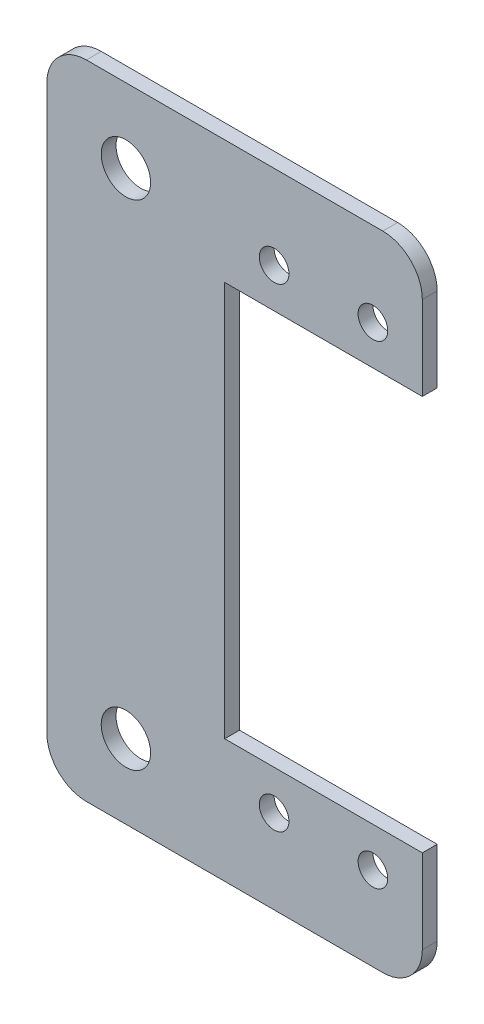
ISO-10303-21;
HEADER;
FILE_DESCRIPTION(('STEP AP214'),'2;1');
FILE_NAME('part.step','',(''),(''),'','','');
FILE_SCHEMA(('AUTOMOTIVE_DESIGN { 1 0 10303 214 1 1 1 1 }'));
ENDSEC;
DATA;
#1=APPLICATION_CONTEXT('core data for automotive mechanical design processes');
#2=APPLICATION_PROTOCOL_DEFINITION('international standard','automotive_design',2000,#1);
#3=PRODUCT_CONTEXT('',#1,'mechanical');
#4=PRODUCT('Part','Part','',(#3));
#5=PRODUCT_RELATED_PRODUCT_CATEGORY('part','',(#4));
#6=PRODUCT_DEFINITION_FORMATION('','',#4);
#7=PRODUCT_DEFINITION_CONTEXT('part definition',#1,'design');
#8=PRODUCT_DEFINITION('design','',#6,#7);
#9=PRODUCT_DEFINITION_SHAPE('','',#8);
#10=(LENGTH_UNIT() NAMED_UNIT(*) SI_UNIT(.MILLI.,.METRE.));
#11=(NAMED_UNIT(*) PLANE_ANGLE_UNIT() SI_UNIT($,.RADIAN.));
#12=(NAMED_UNIT(*) SI_UNIT($,.STERADIAN.) SOLID_ANGLE_UNIT());
#13=UNCERTAINTY_MEASURE_WITH_UNIT(LENGTH_MEASURE(1.E-05),#10,'distance_accuracy_value','');
#14=(GEOMETRIC_REPRESENTATION_CONTEXT(3) GLOBAL_UNCERTAINTY_ASSIGNED_CONTEXT((#13)) GLOBAL_UNIT_ASSIGNED_CONTEXT((#10,
#11,#12)) REPRESENTATION_CONTEXT('',''));
#15=CARTESIAN_POINT('',(0.,0.,0.));
#16=DIRECTION('',(0.,0.,1.));
#17=DIRECTION('',(1.,0.,0.));
#18=AXIS2_PLACEMENT_3D('',#15,#16,#17);
#19=CARTESIAN_POINT('',(0.,0.,1.5));
#20=DIRECTION('',(0.,0.,1.));
#21=DIRECTION('',(1.,0.,0.));
#22=AXIS2_PLACEMENT_3D('',#19,#20,#21);
#23=PLANE('',#22);
#24=CARTESIAN_POINT('',(23.,-24.,1.5));
#25=DIRECTION('',(0.,0.,1.));
#26=DIRECTION('',(-1.,0.,0.));
#27=AXIS2_PLACEMENT_3D('',#24,#25,#26);
#28=CIRCLE('',#27,1.5);
#29=CARTESIAN_POINT('',(21.5,-24.,1.5));
#30=VERTEX_POINT('',#29);
#31=EDGE_CURVE('E255',#30,#30,#28,.T.);
#32=ORIENTED_EDGE('',*,*,#31,.F.);
#33=EDGE_LOOP('',(#32));
#34=FACE_BOUND('',#33,.T.);
#35=CARTESIAN_POINT('',(33.,24.,1.5));
#36=DIRECTION('',(0.,0.,1.));
#37=DIRECTION('',(-1.,0.,0.));
#38=AXIS2_PLACEMENT_3D('',#35,#36,#37);
#39=CIRCLE('',#38,1.5);
#40=CARTESIAN_POINT('',(31.5,24.,1.5));
#41=VERTEX_POINT('',#40);
#42=EDGE_CURVE('E243',#41,#41,#39,.T.);
#43=ORIENTED_EDGE('',*,*,#42,.F.);
#44=EDGE_LOOP('',(#43));
#45=FACE_BOUND('',#44,.T.);
#46=CARTESIAN_POINT('',(8.,25.,1.5));
#47=DIRECTION('',(0.,0.,1.));
#48=DIRECTION('',(1.,0.,0.));
#49=AXIS2_PLACEMENT_3D('',#46,#47,#48);
#50=CIRCLE('',#49,2.5);
#51=CARTESIAN_POINT('',(10.5,25.,1.5));
#52=VERTEX_POINT('',#51);
#53=EDGE_CURVE('E225',#52,#52,#50,.T.);
#54=ORIENTED_EDGE('',*,*,#53,.F.);
#55=EDGE_LOOP('',(#54));
#56=FACE_BOUND('',#55,.T.);
#57=DIRECTION('',(0.,-1.,0.));
#58=VECTOR('',#57,1.);
#59=CARTESIAN_POINT('',(0.,32.5,1.5));
#60=LINE('',#59,#58);
#61=CARTESIAN_POINT('',(0.,28.5,1.5));
#62=VERTEX_POINT('',#61);
#63=CARTESIAN_POINT('',(0.,-28.5,1.5));
#64=VERTEX_POINT('',#63);
#65=EDGE_CURVE('E229',#62,#64,#60,.T.);
#66=ORIENTED_EDGE('',*,*,#65,.T.);
#67=CARTESIAN_POINT('',(4.,-28.5,1.5));
#68=DIRECTION('',(0.,0.,1.));
#69=DIRECTION('',(1.,0.,0.));
#70=AXIS2_PLACEMENT_3D('',#67,#68,#69);
#71=CIRCLE('',#70,4.);
#72=CARTESIAN_POINT('',(4.,-32.5,1.5));
#73=VERTEX_POINT('',#72);
#74=EDGE_CURVE('E176',#64,#73,#71,.T.);
#75=ORIENTED_EDGE('',*,*,#74,.T.);
#76=DIRECTION('',(1.,0.,0.));
#77=VECTOR('',#76,1.);
#78=CARTESIAN_POINT('',(38.,-32.5,1.5));
#79=LINE('',#78,#77);
#80=CARTESIAN_POINT('',(34.,-32.5,1.5));
#81=VERTEX_POINT('',#80);
#82=EDGE_CURVE('E227',#73,#81,#79,.T.);
#83=ORIENTED_EDGE('',*,*,#82,.T.);
#84=CARTESIAN_POINT('',(34.,-28.5,1.5));
#85=DIRECTION('',(0.,0.,1.));
#86=DIRECTION('',(1.,0.,0.));
#87=AXIS2_PLACEMENT_3D('',#84,#85,#86);
#88=CIRCLE('',#87,4.);
#89=CARTESIAN_POINT('',(38.,-28.5,1.5));
#90=VERTEX_POINT('',#89);
#91=EDGE_CURVE('E49',#81,#90,#88,.T.);
#92=ORIENTED_EDGE('',*,*,#91,.T.);
#93=DIRECTION('',(0.,1.,0.));
#94=VECTOR('',#93,1.);
#95=CARTESIAN_POINT('',(38.,-20.,1.5));
#96=LINE('',#95,#94);
#97=CARTESIAN_POINT('',(38.,-20.,1.5));
#98=VERTEX_POINT('',#97);
#99=EDGE_CURVE('E139',#90,#98,#96,.T.);
#100=ORIENTED_EDGE('',*,*,#99,.T.);
#101=DIRECTION('',(-1.,0.,0.));
#102=VECTOR('',#101,1.);
#103=CARTESIAN_POINT('',(38.,-20.,1.5));
#104=LINE('',#103,#102);
#105=CARTESIAN_POINT('',(18.,-20.,1.5));
#106=VERTEX_POINT('',#105);
#107=EDGE_CURVE('E134',#98,#106,#104,.T.);
#108=ORIENTED_EDGE('',*,*,#107,.T.);
#109=DIRECTION('',(0.,1.,0.));
#110=VECTOR('',#109,1.);
#111=CARTESIAN_POINT('',(18.,20.,1.5));
#112=LINE('',#111,#110);
#113=CARTESIAN_POINT('',(18.,20.,1.5));
#114=VERTEX_POINT('',#113);
#115=EDGE_CURVE('E124',#106,#114,#112,.T.);
#116=ORIENTED_EDGE('',*,*,#115,.T.);
#117=DIRECTION('',(1.,0.,0.));
#118=VECTOR('',#117,1.);
#119=CARTESIAN_POINT('',(38.,20.,1.5));
#120=LINE('',#119,#118);
#121=CARTESIAN_POINT('',(38.,20.,1.5));
#122=VERTEX_POINT('',#121);
#123=EDGE_CURVE('E133',#114,#122,#120,.T.);
#124=ORIENTED_EDGE('',*,*,#123,.T.);
#125=DIRECTION('',(0.,1.,0.));
#126=VECTOR('',#125,1.);
#127=CARTESIAN_POINT('',(38.,32.5,1.5));
#128=LINE('',#127,#126);
#129=CARTESIAN_POINT('',(38.,28.5,1.5));
#130=VERTEX_POINT('',#129);
#131=EDGE_CURVE('E218',#122,#130,#128,.T.);
#132=ORIENTED_EDGE('',*,*,#131,.T.);
#133=CARTESIAN_POINT('',(34.,28.5,1.5));
#134=DIRECTION('',(0.,0.,1.));
#135=DIRECTION('',(1.,0.,0.));
#136=AXIS2_PLACEMENT_3D('',#133,#134,#135);
#137=CIRCLE('',#136,4.);
#138=CARTESIAN_POINT('',(34.,32.5,1.5));
#139=VERTEX_POINT('',#138);
#140=EDGE_CURVE('E171',#130,#139,#137,.T.);
#141=ORIENTED_EDGE('',*,*,#140,.T.);
#142=DIRECTION('',(-1.,0.,0.));
#143=VECTOR('',#142,1.);
#144=CARTESIAN_POINT('',(38.,32.5,1.5));
#145=LINE('',#144,#143);
#146=CARTESIAN_POINT('',(4.,32.5,1.5));
#147=VERTEX_POINT('',#146);
#148=EDGE_CURVE('E187',#139,#147,#145,.T.);
#149=ORIENTED_EDGE('',*,*,#148,.T.);
#150=CARTESIAN_POINT('',(4.00000000000001,28.5,1.5));
#151=DIRECTION('',(0.,0.,1.));
#152=DIRECTION('',(1.,0.,0.));
#153=AXIS2_PLACEMENT_3D('',#150,#151,#152);
#154=CIRCLE('',#153,4.);
#155=EDGE_CURVE('E173',#147,#62,#154,.T.);
#156=ORIENTED_EDGE('',*,*,#155,.T.);
#157=EDGE_LOOP('',(#66,#75,#83,#92,#100,#108,#116,#124,#132,#141,#149,#156));
#158=FACE_BOUND('',#157,.T.);
#159=CARTESIAN_POINT('',(23.,24.,1.5));
#160=DIRECTION('',(0.,0.,1.));
#161=DIRECTION('',(1.,0.,0.));
#162=AXIS2_PLACEMENT_3D('',#159,#160,#161);
#163=CIRCLE('',#162,1.5);
#164=CARTESIAN_POINT('',(24.5,24.,1.5));
#165=VERTEX_POINT('',#164);
#166=EDGE_CURVE('E237',#165,#165,#163,.T.);
#167=ORIENTED_EDGE('',*,*,#166,.F.);
#168=EDGE_LOOP('',(#167));
#169=FACE_BOUND('',#168,.T.);
#170=CARTESIAN_POINT('',(33.,-24.,1.5));
#171=DIRECTION('',(0.,0.,1.));
#172=DIRECTION('',(1.,0.,0.));
#173=AXIS2_PLACEMENT_3D('',#170,#171,#172);
#174=CIRCLE('',#173,1.5);
#175=CARTESIAN_POINT('',(34.5,-24.,1.5));
#176=VERTEX_POINT('',#175);
#177=EDGE_CURVE('E249',#176,#176,#174,.T.);
#178=ORIENTED_EDGE('',*,*,#177,.F.);
#179=EDGE_LOOP('',(#178));
#180=FACE_BOUND('',#179,.T.);
#181=CARTESIAN_POINT('',(8.,-25.,1.5));
#182=DIRECTION('',(0.,0.,1.));
#183=DIRECTION('',(-1.,0.,0.));
#184=AXIS2_PLACEMENT_3D('',#181,#182,#183);
#185=CIRCLE('',#184,2.5);
#186=CARTESIAN_POINT('',(5.5,-25.,1.5));
#187=VERTEX_POINT('',#186);
#188=EDGE_CURVE('E261',#187,#187,#185,.T.);
#189=ORIENTED_EDGE('',*,*,#188,.F.);
#190=EDGE_LOOP('',(#189));
#191=FACE_BOUND('',#190,.T.);
#192=ADVANCED_FACE('F34',(#34,#45,#56,#158,#169,#180,#191),#23,.T.);
#193=CARTESIAN_POINT('',(0.,0.,0.));
#194=DIRECTION('',(0.,0.,1.));
#195=DIRECTION('',(1.,0.,0.));
#196=AXIS2_PLACEMENT_3D('',#193,#194,#195);
#197=PLANE('',#196);
#198=CARTESIAN_POINT('',(23.,-24.,0.));
#199=DIRECTION('',(0.,0.,1.));
#200=DIRECTION('',(-1.,0.,0.));
#201=AXIS2_PLACEMENT_3D('',#198,#199,#200);
#202=CIRCLE('',#201,1.5);
#203=CARTESIAN_POINT('',(21.5,-24.,0.));
#204=VERTEX_POINT('',#203);
#205=EDGE_CURVE('E258',#204,#204,#202,.T.);
#206=ORIENTED_EDGE('',*,*,#205,.T.);
#207=EDGE_LOOP('',(#206));
#208=FACE_BOUND('',#207,.T.);
#209=CARTESIAN_POINT('',(33.,24.,0.));
#210=DIRECTION('',(0.,0.,1.));
#211=DIRECTION('',(-1.,0.,0.));
#212=AXIS2_PLACEMENT_3D('',#209,#210,#211);
#213=CIRCLE('',#212,1.5);
#214=CARTESIAN_POINT('',(31.5,24.,0.));
#215=VERTEX_POINT('',#214);
#216=EDGE_CURVE('E246',#215,#215,#213,.T.);
#217=ORIENTED_EDGE('',*,*,#216,.T.);
#218=EDGE_LOOP('',(#217));
#219=FACE_BOUND('',#218,.T.);
#220=CARTESIAN_POINT('',(8.,25.,0.));
#221=DIRECTION('',(0.,0.,1.));
#222=DIRECTION('',(1.,0.,0.));
#223=AXIS2_PLACEMENT_3D('',#220,#221,#222);
#224=CIRCLE('',#223,2.5);
#225=CARTESIAN_POINT('',(10.5,25.,0.));
#226=VERTEX_POINT('',#225);
#227=EDGE_CURVE('E234',#226,#226,#224,.T.);
#228=ORIENTED_EDGE('',*,*,#227,.T.);
#229=EDGE_LOOP('',(#228));
#230=FACE_BOUND('',#229,.T.);
#231=DIRECTION('',(1.,0.,0.));
#232=VECTOR('',#231,1.);
#233=CARTESIAN_POINT('',(38.,-32.5,0.));
#234=LINE('',#233,#232);
#235=CARTESIAN_POINT('',(4.,-32.5,0.));
#236=VERTEX_POINT('',#235);
#237=CARTESIAN_POINT('',(34.,-32.5,0.));
#238=VERTEX_POINT('',#237);
#239=EDGE_CURVE('E201',#236,#238,#234,.T.);
#240=ORIENTED_EDGE('',*,*,#239,.F.);
#241=CARTESIAN_POINT('',(4.,-28.5,0.));
#242=DIRECTION('',(0.,0.,1.));
#243=DIRECTION('',(1.,0.,0.));
#244=AXIS2_PLACEMENT_3D('',#241,#242,#243);
#245=CIRCLE('',#244,4.);
#246=CARTESIAN_POINT('',(0.,-28.5,0.));
#247=VERTEX_POINT('',#246);
#248=EDGE_CURVE('E164',#236,#247,#245,.F.);
#249=ORIENTED_EDGE('',*,*,#248,.T.);
#250=DIRECTION('',(0.,-1.,0.));
#251=VECTOR('',#250,1.);
#252=CARTESIAN_POINT('',(0.,32.5,0.));
#253=LINE('',#252,#251);
#254=CARTESIAN_POINT('',(0.,28.5,0.));
#255=VERTEX_POINT('',#254);
#256=EDGE_CURVE('E197',#255,#247,#253,.T.);
#257=ORIENTED_EDGE('',*,*,#256,.F.);
#258=CARTESIAN_POINT('',(4.00000000000001,28.5,0.));
#259=DIRECTION('',(0.,0.,1.));
#260=DIRECTION('',(1.,0.,0.));
#261=AXIS2_PLACEMENT_3D('',#258,#259,#260);
#262=CIRCLE('',#261,4.);
#263=CARTESIAN_POINT('',(4.,32.5,0.));
#264=VERTEX_POINT('',#263);
#265=EDGE_CURVE('E160',#255,#264,#262,.F.);
#266=ORIENTED_EDGE('',*,*,#265,.T.);
#267=DIRECTION('',(-1.,0.,0.));
#268=VECTOR('',#267,1.);
#269=CARTESIAN_POINT('',(38.,32.5,0.));
#270=LINE('',#269,#268);
#271=CARTESIAN_POINT('',(34.,32.5,0.));
#272=VERTEX_POINT('',#271);
#273=EDGE_CURVE('E186',#272,#264,#270,.T.);
#274=ORIENTED_EDGE('',*,*,#273,.F.);
#275=CARTESIAN_POINT('',(34.,28.5,0.));
#276=DIRECTION('',(0.,0.,1.));
#277=DIRECTION('',(1.,0.,0.));
#278=AXIS2_PLACEMENT_3D('',#275,#276,#277);
#279=CIRCLE('',#278,4.);
#280=CARTESIAN_POINT('',(38.,28.5,0.));
#281=VERTEX_POINT('',#280);
#282=EDGE_CURVE('E158',#272,#281,#279,.F.);
#283=ORIENTED_EDGE('',*,*,#282,.T.);
#284=DIRECTION('',(0.,1.,0.));
#285=VECTOR('',#284,1.);
#286=CARTESIAN_POINT('',(38.,32.5,0.));
#287=LINE('',#286,#285);
#288=CARTESIAN_POINT('',(38.,20.,0.));
#289=VERTEX_POINT('',#288);
#290=EDGE_CURVE('E198',#289,#281,#287,.T.);
#291=ORIENTED_EDGE('',*,*,#290,.F.);
#292=DIRECTION('',(1.,0.,0.));
#293=VECTOR('',#292,1.);
#294=CARTESIAN_POINT('',(38.,20.,0.));
#295=LINE('',#294,#293);
#296=CARTESIAN_POINT('',(18.,20.,0.));
#297=VERTEX_POINT('',#296);
#298=EDGE_CURVE('E203',#297,#289,#295,.T.);
#299=ORIENTED_EDGE('',*,*,#298,.F.);
#300=DIRECTION('',(0.,1.,0.));
#301=VECTOR('',#300,1.);
#302=CARTESIAN_POINT('',(18.,20.,0.));
#303=LINE('',#302,#301);
#304=CARTESIAN_POINT('',(18.,-20.,0.));
#305=VERTEX_POINT('',#304);
#306=EDGE_CURVE('E221',#305,#297,#303,.T.);
#307=ORIENTED_EDGE('',*,*,#306,.F.);
#308=DIRECTION('',(-1.,0.,0.));
#309=VECTOR('',#308,1.);
#310=CARTESIAN_POINT('',(38.,-20.,0.));
#311=LINE('',#310,#309);
#312=CARTESIAN_POINT('',(38.,-20.,0.));
#313=VERTEX_POINT('',#312);
#314=EDGE_CURVE('E147',#313,#305,#311,.T.);
#315=ORIENTED_EDGE('',*,*,#314,.F.);
#316=DIRECTION('',(0.,1.,0.));
#317=VECTOR('',#316,1.);
#318=CARTESIAN_POINT('',(38.,-20.,0.));
#319=LINE('',#318,#317);
#320=CARTESIAN_POINT('',(38.,-28.5,0.));
#321=VERTEX_POINT('',#320);
#322=EDGE_CURVE('E143',#321,#313,#319,.T.);
#323=ORIENTED_EDGE('',*,*,#322,.F.);
#324=CARTESIAN_POINT('',(34.,-28.5,0.));
#325=DIRECTION('',(0.,0.,1.));
#326=DIRECTION('',(1.,0.,0.));
#327=AXIS2_PLACEMENT_3D('',#324,#325,#326);
#328=CIRCLE('',#327,4.);
#329=EDGE_CURVE('E162',#321,#238,#328,.F.);
#330=ORIENTED_EDGE('',*,*,#329,.T.);
#331=EDGE_LOOP('',(#240,#249,#257,#266,#274,#283,#291,#299,#307,#315,#323,#330));
#332=FACE_BOUND('',#331,.T.);
#333=CARTESIAN_POINT('',(23.,24.,0.));
#334=DIRECTION('',(0.,0.,1.));
#335=DIRECTION('',(1.,0.,0.));
#336=AXIS2_PLACEMENT_3D('',#333,#334,#335);
#337=CIRCLE('',#336,1.5);
#338=CARTESIAN_POINT('',(24.5,24.,0.));
#339=VERTEX_POINT('',#338);
#340=EDGE_CURVE('E240',#339,#339,#337,.T.);
#341=ORIENTED_EDGE('',*,*,#340,.T.);
#342=EDGE_LOOP('',(#341));
#343=FACE_BOUND('',#342,.T.);
#344=CARTESIAN_POINT('',(33.,-24.,0.));
#345=DIRECTION('',(0.,0.,1.));
#346=DIRECTION('',(1.,0.,0.));
#347=AXIS2_PLACEMENT_3D('',#344,#345,#346);
#348=CIRCLE('',#347,1.5);
#349=CARTESIAN_POINT('',(34.5,-24.,0.));
#350=VERTEX_POINT('',#349);
#351=EDGE_CURVE('E252',#350,#350,#348,.T.);
#352=ORIENTED_EDGE('',*,*,#351,.T.);
#353=EDGE_LOOP('',(#352));
#354=FACE_BOUND('',#353,.T.);
#355=CARTESIAN_POINT('',(8.,-25.,0.));
#356=DIRECTION('',(0.,0.,1.));
#357=DIRECTION('',(-1.,0.,0.));
#358=AXIS2_PLACEMENT_3D('',#355,#356,#357);
#359=CIRCLE('',#358,2.5);
#360=CARTESIAN_POINT('',(5.5,-25.,0.));
#361=VERTEX_POINT('',#360);
#362=EDGE_CURVE('E264',#361,#361,#359,.T.);
#363=ORIENTED_EDGE('',*,*,#362,.T.);
#364=EDGE_LOOP('',(#363));
#365=FACE_BOUND('',#364,.T.);
#366=ADVANCED_FACE('F192',(#208,#219,#230,#332,#343,#354,#365),#197,.F.);
#367=CARTESIAN_POINT('',(38.,-20.,1.5));
#368=DIRECTION('',(0.,-1.,0.));
#369=DIRECTION('',(0.,0.,-1.));
#370=AXIS2_PLACEMENT_3D('',#367,#368,#369);
#371=PLANE('',#370);
#372=ORIENTED_EDGE('',*,*,#314,.T.);
#373=DIRECTION('',(0.,0.,-1.));
#374=VECTOR('',#373,1.);
#375=CARTESIAN_POINT('',(18.,-20.,1.5));
#376=LINE('',#375,#374);
#377=EDGE_CURVE('E128',#106,#305,#376,.T.);
#378=ORIENTED_EDGE('',*,*,#377,.F.);
#379=ORIENTED_EDGE('',*,*,#107,.F.);
#380=DIRECTION('',(0.,0.,-1.));
#381=VECTOR('',#380,1.);
#382=CARTESIAN_POINT('',(38.,-20.,1.5));
#383=LINE('',#382,#381);
#384=EDGE_CURVE('E210',#98,#313,#383,.T.);
#385=ORIENTED_EDGE('',*,*,#384,.T.);
#386=EDGE_LOOP('',(#372,#378,#379,#385));
#387=FACE_BOUND('',#386,.T.);
#388=ADVANCED_FACE('F145',(#387),#371,.F.);
#389=CARTESIAN_POINT('',(18.,20.,1.5));
#390=DIRECTION('',(-1.,0.,0.));
#391=DIRECTION('',(0.,0.,1.));
#392=AXIS2_PLACEMENT_3D('',#389,#390,#391);
#393=PLANE('',#392);
#394=ORIENTED_EDGE('',*,*,#306,.T.);
#395=DIRECTION('',(0.,0.,-1.));
#396=VECTOR('',#395,1.);
#397=CARTESIAN_POINT('',(18.,20.,1.5));
#398=LINE('',#397,#396);
#399=EDGE_CURVE('E131',#114,#297,#398,.T.);
#400=ORIENTED_EDGE('',*,*,#399,.F.);
#401=ORIENTED_EDGE('',*,*,#115,.F.);
#402=ORIENTED_EDGE('',*,*,#377,.T.);
#403=EDGE_LOOP('',(#394,#400,#401,#402));
#404=FACE_BOUND('',#403,.T.);
#405=ADVANCED_FACE('F126',(#404),#393,.F.);
#406=CARTESIAN_POINT('',(38.,20.,1.5));
#407=DIRECTION('',(0.,1.,0.));
#408=DIRECTION('',(0.,0.,1.));
#409=AXIS2_PLACEMENT_3D('',#406,#407,#408);
#410=PLANE('',#409);
#411=ORIENTED_EDGE('',*,*,#298,.T.);
#412=DIRECTION('',(0.,0.,-1.));
#413=VECTOR('',#412,1.);
#414=CARTESIAN_POINT('',(38.,20.,1.5));
#415=LINE('',#414,#413);
#416=EDGE_CURVE('E152',#122,#289,#415,.T.);
#417=ORIENTED_EDGE('',*,*,#416,.F.);
#418=ORIENTED_EDGE('',*,*,#123,.F.);
#419=ORIENTED_EDGE('',*,*,#399,.T.);
#420=EDGE_LOOP('',(#411,#417,#418,#419));
#421=FACE_BOUND('',#420,.T.);
#422=ADVANCED_FACE('F303',(#421),#410,.F.);
#423=CARTESIAN_POINT('',(38.,32.5,1.5));
#424=DIRECTION('',(-1.,0.,0.));
#425=DIRECTION('',(0.,-1.,0.));
#426=AXIS2_PLACEMENT_3D('',#423,#424,#425);
#427=PLANE('',#426);
#428=ORIENTED_EDGE('',*,*,#290,.T.);
#429=DIRECTION('',(0.,0.,-1.));
#430=VECTOR('',#429,1.);
#431=CARTESIAN_POINT('',(38.,28.5,1.5));
#432=LINE('',#431,#430);
#433=EDGE_CURVE('E11',#281,#130,#432,.F.);
#434=ORIENTED_EDGE('',*,*,#433,.T.);
#435=ORIENTED_EDGE('',*,*,#131,.F.);
#436=ORIENTED_EDGE('',*,*,#416,.T.);
#437=EDGE_LOOP('',(#428,#434,#435,#436));
#438=FACE_BOUND('',#437,.T.);
#439=ADVANCED_FACE('F215',(#438),#427,.F.);
#440=CARTESIAN_POINT('',(38.,32.5,1.5));
#441=DIRECTION('',(0.,-1.,0.));
#442=DIRECTION('',(1.,0.,0.));
#443=AXIS2_PLACEMENT_3D('',#440,#441,#442);
#444=PLANE('',#443);
#445=ORIENTED_EDGE('',*,*,#273,.T.);
#446=DIRECTION('',(0.,0.,-1.));
#447=VECTOR('',#446,1.);
#448=CARTESIAN_POINT('',(4.,32.5,1.5));
#449=LINE('',#448,#447);
#450=EDGE_CURVE('E42',#264,#147,#449,.F.);
#451=ORIENTED_EDGE('',*,*,#450,.T.);
#452=ORIENTED_EDGE('',*,*,#148,.F.);
#453=DIRECTION('',(0.,0.,-1.));
#454=VECTOR('',#453,1.);
#455=CARTESIAN_POINT('',(34.,32.5,1.5));
#456=LINE('',#455,#454);
#457=EDGE_CURVE('E181',#139,#272,#456,.T.);
#458=ORIENTED_EDGE('',*,*,#457,.T.);
#459=EDGE_LOOP('',(#445,#451,#452,#458));
#460=FACE_BOUND('',#459,.T.);
#461=ADVANCED_FACE('F185',(#460),#444,.F.);
#462=CARTESIAN_POINT('',(0.,32.5,1.5));
#463=DIRECTION('',(1.,0.,0.));
#464=DIRECTION('',(0.,0.,-1.));
#465=AXIS2_PLACEMENT_3D('',#462,#463,#464);
#466=PLANE('',#465);
#467=ORIENTED_EDGE('',*,*,#256,.T.);
#468=DIRECTION('',(0.,0.,-1.));
#469=VECTOR('',#468,1.);
#470=CARTESIAN_POINT('',(0.,-28.5,1.5));
#471=LINE('',#470,#469);
#472=EDGE_CURVE('E169',#247,#64,#471,.F.);
#473=ORIENTED_EDGE('',*,*,#472,.T.);
#474=ORIENTED_EDGE('',*,*,#65,.F.);
#475=DIRECTION('',(0.,0.,-1.));
#476=VECTOR('',#475,1.);
#477=CARTESIAN_POINT('',(0.,28.5,1.5));
#478=LINE('',#477,#476);
#479=EDGE_CURVE('E166',#62,#255,#478,.T.);
#480=ORIENTED_EDGE('',*,*,#479,.T.);
#481=EDGE_LOOP('',(#467,#473,#474,#480));
#482=FACE_BOUND('',#481,.T.);
#483=ADVANCED_FACE('F294',(#482),#466,.F.);
#484=CARTESIAN_POINT('',(38.,-32.5,1.5));
#485=DIRECTION('',(0.,1.,0.));
#486=DIRECTION('',(-1.,0.,0.));
#487=AXIS2_PLACEMENT_3D('',#484,#485,#486);
#488=PLANE('',#487);
#489=ORIENTED_EDGE('',*,*,#82,.F.);
#490=DIRECTION('',(0.,0.,-1.));
#491=VECTOR('',#490,1.);
#492=CARTESIAN_POINT('',(4.,-32.5,1.5));
#493=LINE('',#492,#491);
#494=EDGE_CURVE('E150',#73,#236,#493,.T.);
#495=ORIENTED_EDGE('',*,*,#494,.T.);
#496=ORIENTED_EDGE('',*,*,#239,.T.);
#497=DIRECTION('',(0.,0.,-1.));
#498=VECTOR('',#497,1.);
#499=CARTESIAN_POINT('',(34.,-32.5,1.5));
#500=LINE('',#499,#498);
#501=EDGE_CURVE('E148',#238,#81,#500,.F.);
#502=ORIENTED_EDGE('',*,*,#501,.T.);
#503=EDGE_LOOP('',(#489,#495,#496,#502));
#504=FACE_BOUND('',#503,.T.);
#505=ADVANCED_FACE('F290',(#504),#488,.F.);
#506=CARTESIAN_POINT('',(38.,-20.,1.5));
#507=DIRECTION('',(-1.,0.,0.));
#508=DIRECTION('',(0.,-1.,0.));
#509=AXIS2_PLACEMENT_3D('',#506,#507,#508);
#510=PLANE('',#509);
#511=ORIENTED_EDGE('',*,*,#99,.F.);
#512=DIRECTION('',(0.,0.,-1.));
#513=VECTOR('',#512,1.);
#514=CARTESIAN_POINT('',(38.,-28.5,1.5));
#515=LINE('',#514,#513);
#516=EDGE_CURVE('E178',#90,#321,#515,.T.);
#517=ORIENTED_EDGE('',*,*,#516,.T.);
#518=ORIENTED_EDGE('',*,*,#322,.T.);
#519=ORIENTED_EDGE('',*,*,#384,.F.);
#520=EDGE_LOOP('',(#511,#517,#518,#519));
#521=FACE_BOUND('',#520,.T.);
#522=ADVANCED_FACE('F287',(#521),#510,.F.);
#523=CARTESIAN_POINT('',(8.,25.,1.5));
#524=DIRECTION('',(0.,0.,-1.));
#525=DIRECTION('',(-1.,0.,0.));
#526=AXIS2_PLACEMENT_3D('',#523,#524,#525);
#527=CYLINDRICAL_SURFACE('',#526,2.5);
#528=ORIENTED_EDGE('',*,*,#53,.T.);
#529=EDGE_LOOP('',(#528));
#530=FACE_BOUND('',#529,.T.);
#531=ORIENTED_EDGE('',*,*,#227,.F.);
#532=EDGE_LOOP('',(#531));
#533=FACE_BOUND('',#532,.T.);
#534=ADVANCED_FACE('F284',(#530,#533),#527,.F.);
#535=CARTESIAN_POINT('',(23.,24.,1.5));
#536=DIRECTION('',(0.,0.,-1.));
#537=DIRECTION('',(-1.,0.,0.));
#538=AXIS2_PLACEMENT_3D('',#535,#536,#537);
#539=CYLINDRICAL_SURFACE('',#538,1.5);
#540=ORIENTED_EDGE('',*,*,#166,.T.);
#541=EDGE_LOOP('',(#540));
#542=FACE_BOUND('',#541,.T.);
#543=ORIENTED_EDGE('',*,*,#340,.F.);
#544=EDGE_LOOP('',(#543));
#545=FACE_BOUND('',#544,.T.);
#546=ADVANCED_FACE('F433',(#542,#545),#539,.F.);
#547=CARTESIAN_POINT('',(33.,24.,1.5));
#548=DIRECTION('',(0.,0.,-1.));
#549=DIRECTION('',(-1.,0.,0.));
#550=AXIS2_PLACEMENT_3D('',#547,#548,#549);
#551=CYLINDRICAL_SURFACE('',#550,1.5);
#552=ORIENTED_EDGE('',*,*,#42,.T.);
#553=EDGE_LOOP('',(#552));
#554=FACE_BOUND('',#553,.T.);
#555=ORIENTED_EDGE('',*,*,#216,.F.);
#556=EDGE_LOOP('',(#555));
#557=FACE_BOUND('',#556,.T.);
#558=ADVANCED_FACE('F423',(#554,#557),#551,.F.);
#559=CARTESIAN_POINT('',(33.,-24.,1.5));
#560=DIRECTION('',(0.,0.,-1.));
#561=DIRECTION('',(-1.,0.,0.));
#562=AXIS2_PLACEMENT_3D('',#559,#560,#561);
#563=CYLINDRICAL_SURFACE('',#562,1.5);
#564=ORIENTED_EDGE('',*,*,#177,.T.);
#565=EDGE_LOOP('',(#564));
#566=FACE_BOUND('',#565,.T.);
#567=ORIENTED_EDGE('',*,*,#351,.F.);
#568=EDGE_LOOP('',(#567));
#569=FACE_BOUND('',#568,.T.);
#570=ADVANCED_FACE('F413',(#566,#569),#563,.F.);
#571=CARTESIAN_POINT('',(23.,-24.,1.5));
#572=DIRECTION('',(0.,0.,-1.));
#573=DIRECTION('',(-1.,0.,0.));
#574=AXIS2_PLACEMENT_3D('',#571,#572,#573);
#575=CYLINDRICAL_SURFACE('',#574,1.5);
#576=ORIENTED_EDGE('',*,*,#31,.T.);
#577=EDGE_LOOP('',(#576));
#578=FACE_BOUND('',#577,.T.);
#579=ORIENTED_EDGE('',*,*,#205,.F.);
#580=EDGE_LOOP('',(#579));
#581=FACE_BOUND('',#580,.T.);
#582=ADVANCED_FACE('F404',(#578,#581),#575,.F.);
#583=CARTESIAN_POINT('',(8.,-25.,1.5));
#584=DIRECTION('',(0.,0.,-1.));
#585=DIRECTION('',(-1.,0.,0.));
#586=AXIS2_PLACEMENT_3D('',#583,#584,#585);
#587=CYLINDRICAL_SURFACE('',#586,2.5);
#588=ORIENTED_EDGE('',*,*,#188,.T.);
#589=EDGE_LOOP('',(#588));
#590=FACE_BOUND('',#589,.T.);
#591=ORIENTED_EDGE('',*,*,#362,.F.);
#592=EDGE_LOOP('',(#591));
#593=FACE_BOUND('',#592,.T.);
#594=ADVANCED_FACE('F270',(#590,#593),#587,.F.);
#595=CARTESIAN_POINT('',(4.,-28.5,1.5));
#596=DIRECTION('',(0.,0.,-1.));
#597=DIRECTION('',(-1.,0.,0.));
#598=AXIS2_PLACEMENT_3D('',#595,#596,#597);
#599=CYLINDRICAL_SURFACE('',#598,4.);
#600=ORIENTED_EDGE('',*,*,#74,.F.);
#601=ORIENTED_EDGE('',*,*,#472,.F.);
#602=ORIENTED_EDGE('',*,*,#248,.F.);
#603=ORIENTED_EDGE('',*,*,#494,.F.);
#604=EDGE_LOOP('',(#600,#601,#602,#603));
#605=FACE_BOUND('',#604,.T.);
#606=ADVANCED_FACE('F310',(#605),#599,.T.);
#607=CARTESIAN_POINT('',(34.,-28.5,1.5));
#608=DIRECTION('',(0.,0.,-1.));
#609=DIRECTION('',(-1.,0.,0.));
#610=AXIS2_PLACEMENT_3D('',#607,#608,#609);
#611=CYLINDRICAL_SURFACE('',#610,4.);
#612=ORIENTED_EDGE('',*,*,#91,.F.);
#613=ORIENTED_EDGE('',*,*,#501,.F.);
#614=ORIENTED_EDGE('',*,*,#329,.F.);
#615=ORIENTED_EDGE('',*,*,#516,.F.);
#616=EDGE_LOOP('',(#612,#613,#614,#615));
#617=FACE_BOUND('',#616,.T.);
#618=ADVANCED_FACE('F313',(#617),#611,.T.);
#619=CARTESIAN_POINT('',(4.00000000000001,28.5,1.5));
#620=DIRECTION('',(0.,0.,-1.));
#621=DIRECTION('',(-1.,0.,0.));
#622=AXIS2_PLACEMENT_3D('',#619,#620,#621);
#623=CYLINDRICAL_SURFACE('',#622,4.);
#624=ORIENTED_EDGE('',*,*,#155,.F.);
#625=ORIENTED_EDGE('',*,*,#450,.F.);
#626=ORIENTED_EDGE('',*,*,#265,.F.);
#627=ORIENTED_EDGE('',*,*,#479,.F.);
#628=EDGE_LOOP('',(#624,#625,#626,#627));
#629=FACE_BOUND('',#628,.T.);
#630=ADVANCED_FACE('F316',(#629),#623,.T.);
#631=CARTESIAN_POINT('',(34.,28.5,1.5));
#632=DIRECTION('',(0.,0.,-1.));
#633=DIRECTION('',(-1.,0.,0.));
#634=AXIS2_PLACEMENT_3D('',#631,#632,#633);
#635=CYLINDRICAL_SURFACE('',#634,4.);
#636=ORIENTED_EDGE('',*,*,#140,.F.);
#637=ORIENTED_EDGE('',*,*,#433,.F.);
#638=ORIENTED_EDGE('',*,*,#282,.F.);
#639=ORIENTED_EDGE('',*,*,#457,.F.);
#640=EDGE_LOOP('',(#636,#637,#638,#639));
#641=FACE_BOUND('',#640,.T.);
#642=ADVANCED_FACE('F36',(#641),#635,.T.);
#643=CLOSED_SHELL('',(#192,#366,#388,#405,#422,#439,#461,#483,#505,#522,#534,#546,#558,#570,
#582,#594,#606,#618,#630,#642));
#644=MANIFOLD_SOLID_BREP('B2',#643);
#645=ADVANCED_BREP_SHAPE_REPRESENTATION('',(#18,#644),#14);
#646=SHAPE_DEFINITION_REPRESENTATION(#9,#645);
ENDSEC;
END-ISO-10303-21;
